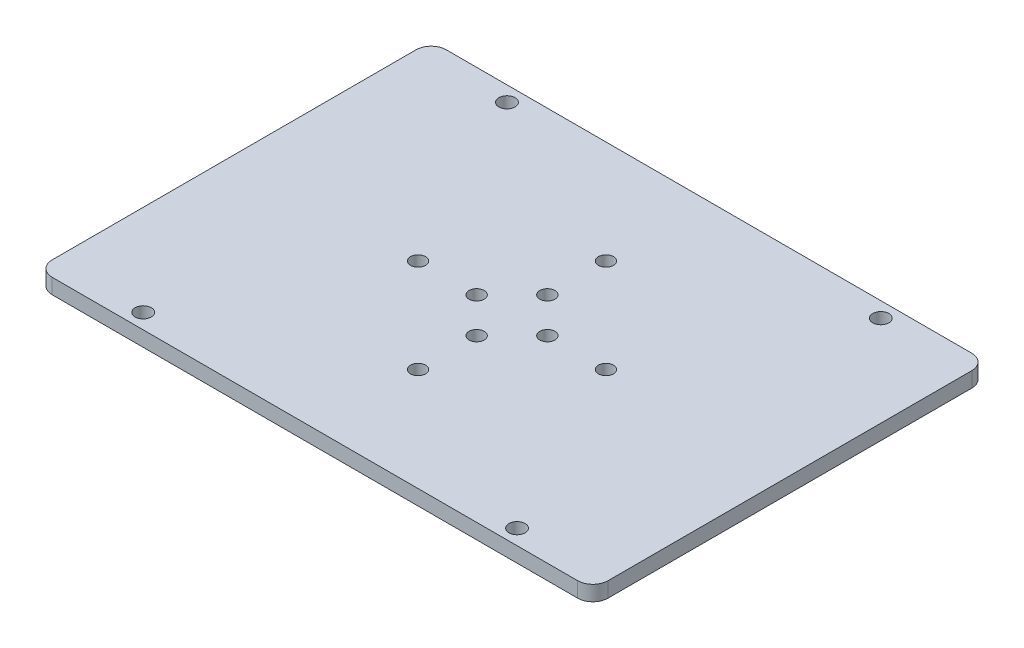
ISO-10303-21;
HEADER;
FILE_DESCRIPTION(('STEP AP214'),'2;1');
FILE_NAME('part.step','',(''),(''),'','','');
FILE_SCHEMA(('AUTOMOTIVE_DESIGN { 1 0 10303 214 1 1 1 1 }'));
ENDSEC;
DATA;
#1=APPLICATION_CONTEXT('core data for automotive mechanical design processes');
#2=APPLICATION_PROTOCOL_DEFINITION('international standard','automotive_design',2000,#1);
#3=PRODUCT_CONTEXT('',#1,'mechanical');
#4=PRODUCT('Part','Part','',(#3));
#5=PRODUCT_RELATED_PRODUCT_CATEGORY('part','',(#4));
#6=PRODUCT_DEFINITION_FORMATION('','',#4);
#7=PRODUCT_DEFINITION_CONTEXT('part definition',#1,'design');
#8=PRODUCT_DEFINITION('design','',#6,#7);
#9=PRODUCT_DEFINITION_SHAPE('','',#8);
#10=(LENGTH_UNIT() NAMED_UNIT(*) SI_UNIT(.MILLI.,.METRE.));
#11=(NAMED_UNIT(*) PLANE_ANGLE_UNIT() SI_UNIT($,.RADIAN.));
#12=(NAMED_UNIT(*) SI_UNIT($,.STERADIAN.) SOLID_ANGLE_UNIT());
#13=UNCERTAINTY_MEASURE_WITH_UNIT(LENGTH_MEASURE(1.E-05),#10,'distance_accuracy_value','');
#14=(GEOMETRIC_REPRESENTATION_CONTEXT(3) GLOBAL_UNCERTAINTY_ASSIGNED_CONTEXT((#13)) GLOBAL_UNIT_ASSIGNED_CONTEXT((#10,
#11,#12)) REPRESENTATION_CONTEXT('',''));
#15=CARTESIAN_POINT('',(0.,0.,0.));
#16=DIRECTION('',(0.,0.,1.));
#17=DIRECTION('',(1.,0.,0.));
#18=AXIS2_PLACEMENT_3D('',#15,#16,#17);
#19=CARTESIAN_POINT('',(0.,3.,0.));
#20=DIRECTION('',(0.,1.,0.));
#21=DIRECTION('',(0.,0.,1.));
#22=AXIS2_PLACEMENT_3D('',#19,#20,#21);
#23=PLANE('',#22);
#24=CARTESIAN_POINT('',(18.6,3.,0.));
#25=DIRECTION('',(0.,1.,0.));
#26=DIRECTION('',(0.,0.,1.));
#27=AXIS2_PLACEMENT_3D('',#24,#25,#26);
#28=CIRCLE('',#27,1.5);
#29=CARTESIAN_POINT('',(18.6,3.,1.5));
#30=VERTEX_POINT('',#29);
#31=EDGE_CURVE('E463',#30,#30,#28,.T.);
#32=ORIENTED_EDGE('',*,*,#31,.F.);
#33=EDGE_LOOP('',(#32));
#34=FACE_BOUND('',#33,.T.);
#35=CARTESIAN_POINT('',(-7.,3.,3.97274077722747E-13));
#36=DIRECTION('',(0.,1.,0.));
#37=DIRECTION('',(0.,0.,1.));
#38=AXIS2_PLACEMENT_3D('',#35,#36,#37);
#39=CIRCLE('',#38,1.50000000000045);
#40=CARTESIAN_POINT('',(-7.,3.,1.50000000000085));
#41=VERTEX_POINT('',#40);
#42=EDGE_CURVE('E465',#41,#41,#39,.T.);
#43=ORIENTED_EDGE('',*,*,#42,.F.);
#44=EDGE_LOOP('',(#43));
#45=FACE_BOUND('',#44,.T.);
#46=CARTESIAN_POINT('',(3.95581973927976E-13,3.,7.0000000000004));
#47=DIRECTION('',(0.,1.,0.));
#48=DIRECTION('',(0.,0.,1.));
#49=AXIS2_PLACEMENT_3D('',#46,#47,#48);
#50=CIRCLE('',#49,1.50000000000031);
#51=CARTESIAN_POINT('',(3.95581973927976E-13,3.,8.50000000000071));
#52=VERTEX_POINT('',#51);
#53=EDGE_CURVE('E471',#52,#52,#50,.T.);
#54=ORIENTED_EDGE('',*,*,#53,.F.);
#55=EDGE_LOOP('',(#54));
#56=FACE_BOUND('',#55,.T.);
#57=CARTESIAN_POINT('',(7.0000000000004,3.,0.));
#58=DIRECTION('',(0.,1.,0.));
#59=DIRECTION('',(0.,0.,1.));
#60=AXIS2_PLACEMENT_3D('',#57,#58,#59);
#61=CIRCLE('',#60,1.49999999999991);
#62=CARTESIAN_POINT('',(7.0000000000004,3.,1.49999999999991));
#63=VERTEX_POINT('',#62);
#64=EDGE_CURVE('E478',#63,#63,#61,.T.);
#65=ORIENTED_EDGE('',*,*,#64,.F.);
#66=EDGE_LOOP('',(#65));
#67=FACE_BOUND('',#66,.T.);
#68=CARTESIAN_POINT('',(-18.6,3.,0.));
#69=DIRECTION('',(0.,1.,0.));
#70=DIRECTION('',(0.,0.,-1.));
#71=AXIS2_PLACEMENT_3D('',#68,#69,#70);
#72=CIRCLE('',#71,1.5);
#73=CARTESIAN_POINT('',(-18.6,3.,-1.5));
#74=VERTEX_POINT('',#73);
#75=EDGE_CURVE('E466',#74,#74,#72,.T.);
#76=ORIENTED_EDGE('',*,*,#75,.F.);
#77=EDGE_LOOP('',(#76));
#78=FACE_BOUND('',#77,.T.);
#79=CARTESIAN_POINT('',(0.,3.,-18.6));
#80=DIRECTION('',(0.,1.,0.));
#81=DIRECTION('',(0.,0.,1.));
#82=AXIS2_PLACEMENT_3D('',#79,#80,#81);
#83=CIRCLE('',#82,1.5);
#84=CARTESIAN_POINT('',(0.,3.,-17.1));
#85=VERTEX_POINT('',#84);
#86=EDGE_CURVE('E474',#85,#85,#83,.T.);
#87=ORIENTED_EDGE('',*,*,#86,.F.);
#88=EDGE_LOOP('',(#87));
#89=FACE_BOUND('',#88,.T.);
#90=CARTESIAN_POINT('',(0.,3.,18.6));
#91=DIRECTION('',(0.,1.,0.));
#92=DIRECTION('',(0.,0.,-1.));
#93=AXIS2_PLACEMENT_3D('',#90,#91,#92);
#94=CIRCLE('',#93,1.5);
#95=CARTESIAN_POINT('',(0.,3.,17.1));
#96=VERTEX_POINT('',#95);
#97=EDGE_CURVE('E516',#96,#96,#94,.T.);
#98=ORIENTED_EDGE('',*,*,#97,.F.);
#99=EDGE_LOOP('',(#98));
#100=FACE_BOUND('',#99,.T.);
#101=CARTESIAN_POINT('',(0.,3.,-7.));
#102=DIRECTION('',(0.,1.,0.));
#103=DIRECTION('',(0.,0.,1.));
#104=AXIS2_PLACEMENT_3D('',#101,#102,#103);
#105=CIRCLE('',#104,1.5);
#106=CARTESIAN_POINT('',(0.,3.,-5.5));
#107=VERTEX_POINT('',#106);
#108=EDGE_CURVE('E196',#107,#107,#105,.T.);
#109=ORIENTED_EDGE('',*,*,#108,.F.);
#110=EDGE_LOOP('',(#109));
#111=FACE_BOUND('',#110,.T.);
#112=CARTESIAN_POINT('',(37.,3.,36.));
#113=DIRECTION('',(0.,1.,0.));
#114=DIRECTION('',(0.,0.,1.));
#115=AXIS2_PLACEMENT_3D('',#112,#113,#114);
#116=CIRCLE('',#115,1.60000000000001);
#117=CARTESIAN_POINT('',(37.,3.,37.6));
#118=VERTEX_POINT('',#117);
#119=EDGE_CURVE('E237',#118,#118,#116,.T.);
#120=ORIENTED_EDGE('',*,*,#119,.F.);
#121=EDGE_LOOP('',(#120));
#122=FACE_BOUND('',#121,.T.);
#123=CARTESIAN_POINT('',(-37.,3.,-36.));
#124=DIRECTION('',(0.,1.,0.));
#125=DIRECTION('',(0.,0.,1.));
#126=AXIS2_PLACEMENT_3D('',#123,#124,#125);
#127=CIRCLE('',#126,1.6);
#128=CARTESIAN_POINT('',(-37.,3.,-34.4));
#129=VERTEX_POINT('',#128);
#130=EDGE_CURVE('E137',#129,#129,#127,.T.);
#131=ORIENTED_EDGE('',*,*,#130,.F.);
#132=EDGE_LOOP('',(#131));
#133=FACE_BOUND('',#132,.T.);
#134=DIRECTION('',(-1.,0.,0.));
#135=VECTOR('',#134,1.);
#136=CARTESIAN_POINT('',(55.,3.,-39.));
#137=LINE('',#136,#135);
#138=CARTESIAN_POINT('',(52.,3.,-39.));
#139=VERTEX_POINT('',#138);
#140=CARTESIAN_POINT('',(-52.,3.,-39.));
#141=VERTEX_POINT('',#140);
#142=EDGE_CURVE('E148',#139,#141,#137,.T.);
#143=ORIENTED_EDGE('',*,*,#142,.T.);
#144=CARTESIAN_POINT('',(-52.,3.,-36.));
#145=DIRECTION('',(0.,1.,0.));
#146=DIRECTION('',(0.,0.,1.));
#147=AXIS2_PLACEMENT_3D('',#144,#145,#146);
#148=CIRCLE('',#147,3.);
#149=CARTESIAN_POINT('',(-55.,3.,-36.));
#150=VERTEX_POINT('',#149);
#151=EDGE_CURVE('E178',#141,#150,#148,.T.);
#152=ORIENTED_EDGE('',*,*,#151,.T.);
#153=DIRECTION('',(0.,0.,1.));
#154=VECTOR('',#153,1.);
#155=CARTESIAN_POINT('',(-55.,3.,39.));
#156=LINE('',#155,#154);
#157=CARTESIAN_POINT('',(-55.,3.,36.));
#158=VERTEX_POINT('',#157);
#159=EDGE_CURVE('E127',#150,#158,#156,.T.);
#160=ORIENTED_EDGE('',*,*,#159,.T.);
#161=CARTESIAN_POINT('',(-52.,3.,36.));
#162=DIRECTION('',(0.,1.,0.));
#163=DIRECTION('',(0.,0.,1.));
#164=AXIS2_PLACEMENT_3D('',#161,#162,#163);
#165=CIRCLE('',#164,3.);
#166=CARTESIAN_POINT('',(-52.,3.,39.));
#167=VERTEX_POINT('',#166);
#168=EDGE_CURVE('E175',#158,#167,#165,.T.);
#169=ORIENTED_EDGE('',*,*,#168,.T.);
#170=DIRECTION('',(1.,0.,0.));
#171=VECTOR('',#170,1.);
#172=CARTESIAN_POINT('',(55.,3.,39.));
#173=LINE('',#172,#171);
#174=CARTESIAN_POINT('',(52.,3.,39.));
#175=VERTEX_POINT('',#174);
#176=EDGE_CURVE('E257',#167,#175,#173,.T.);
#177=ORIENTED_EDGE('',*,*,#176,.T.);
#178=CARTESIAN_POINT('',(52.,3.,36.));
#179=DIRECTION('',(0.,1.,0.));
#180=DIRECTION('',(0.,0.,1.));
#181=AXIS2_PLACEMENT_3D('',#178,#179,#180);
#182=CIRCLE('',#181,3.);
#183=CARTESIAN_POINT('',(55.,3.,36.));
#184=VERTEX_POINT('',#183);
#185=EDGE_CURVE('E61',#175,#184,#182,.T.);
#186=ORIENTED_EDGE('',*,*,#185,.T.);
#187=DIRECTION('',(0.,0.,-1.));
#188=VECTOR('',#187,1.);
#189=CARTESIAN_POINT('',(55.,3.,39.));
#190=LINE('',#189,#188);
#191=CARTESIAN_POINT('',(55.,3.,-36.));
#192=VERTEX_POINT('',#191);
#193=EDGE_CURVE('E259',#184,#192,#190,.T.);
#194=ORIENTED_EDGE('',*,*,#193,.T.);
#195=CARTESIAN_POINT('',(52.,3.,-36.));
#196=DIRECTION('',(0.,1.,0.));
#197=DIRECTION('',(0.,0.,1.));
#198=AXIS2_PLACEMENT_3D('',#195,#196,#197);
#199=CIRCLE('',#198,3.);
#200=EDGE_CURVE('E172',#192,#139,#199,.T.);
#201=ORIENTED_EDGE('',*,*,#200,.T.);
#202=EDGE_LOOP('',(#143,#152,#160,#169,#177,#186,#194,#201));
#203=FACE_BOUND('',#202,.T.);
#204=CARTESIAN_POINT('',(37.,3.,-36.));
#205=DIRECTION('',(0.,1.,0.));
#206=DIRECTION('',(0.,0.,1.));
#207=AXIS2_PLACEMENT_3D('',#204,#205,#206);
#208=CIRCLE('',#207,1.60000000000001);
#209=CARTESIAN_POINT('',(37.,3.,-34.4));
#210=VERTEX_POINT('',#209);
#211=EDGE_CURVE('E245',#210,#210,#208,.T.);
#212=ORIENTED_EDGE('',*,*,#211,.F.);
#213=EDGE_LOOP('',(#212));
#214=FACE_BOUND('',#213,.T.);
#215=CARTESIAN_POINT('',(-37.,3.,36.));
#216=DIRECTION('',(0.,1.,0.));
#217=DIRECTION('',(0.,0.,1.));
#218=AXIS2_PLACEMENT_3D('',#215,#216,#217);
#219=CIRCLE('',#218,1.6);
#220=CARTESIAN_POINT('',(-37.,3.,37.6));
#221=VERTEX_POINT('',#220);
#222=EDGE_CURVE('E227',#221,#221,#219,.T.);
#223=ORIENTED_EDGE('',*,*,#222,.F.);
#224=EDGE_LOOP('',(#223));
#225=FACE_BOUND('',#224,.T.);
#226=ADVANCED_FACE('F38',(#34,#45,#56,#67,#78,#89,#100,#111,#122,#133,#203,#214,#225),#23,.T.);
#227=CARTESIAN_POINT('',(0.,0.,0.));
#228=DIRECTION('',(0.,1.,0.));
#229=DIRECTION('',(0.,0.,1.));
#230=AXIS2_PLACEMENT_3D('',#227,#228,#229);
#231=PLANE('',#230);
#232=CARTESIAN_POINT('',(18.6,0.,0.));
#233=DIRECTION('',(0.,1.,0.));
#234=DIRECTION('',(0.,0.,1.));
#235=AXIS2_PLACEMENT_3D('',#232,#233,#234);
#236=CIRCLE('',#235,1.5);
#237=CARTESIAN_POINT('',(18.6,0.,1.5));
#238=VERTEX_POINT('',#237);
#239=EDGE_CURVE('E42',#238,#238,#236,.T.);
#240=ORIENTED_EDGE('',*,*,#239,.T.);
#241=EDGE_LOOP('',(#240));
#242=FACE_BOUND('',#241,.T.);
#243=CARTESIAN_POINT('',(-7.,0.,3.97274077722747E-13));
#244=DIRECTION('',(0.,1.,0.));
#245=DIRECTION('',(0.,0.,1.));
#246=AXIS2_PLACEMENT_3D('',#243,#244,#245);
#247=CIRCLE('',#246,1.50000000000045);
#248=CARTESIAN_POINT('',(-7.,0.,1.50000000000085));
#249=VERTEX_POINT('',#248);
#250=EDGE_CURVE('E215',#249,#249,#247,.T.);
#251=ORIENTED_EDGE('',*,*,#250,.T.);
#252=EDGE_LOOP('',(#251));
#253=FACE_BOUND('',#252,.T.);
#254=CARTESIAN_POINT('',(3.95581973927976E-13,0.,7.0000000000004));
#255=DIRECTION('',(0.,1.,0.));
#256=DIRECTION('',(0.,0.,1.));
#257=AXIS2_PLACEMENT_3D('',#254,#255,#256);
#258=CIRCLE('',#257,1.50000000000031);
#259=CARTESIAN_POINT('',(3.95581973927976E-13,0.,8.50000000000071));
#260=VERTEX_POINT('',#259);
#261=EDGE_CURVE('E212',#260,#260,#258,.T.);
#262=ORIENTED_EDGE('',*,*,#261,.T.);
#263=EDGE_LOOP('',(#262));
#264=FACE_BOUND('',#263,.T.);
#265=CARTESIAN_POINT('',(7.0000000000004,0.,0.));
#266=DIRECTION('',(0.,1.,0.));
#267=DIRECTION('',(0.,0.,1.));
#268=AXIS2_PLACEMENT_3D('',#265,#266,#267);
#269=CIRCLE('',#268,1.49999999999991);
#270=CARTESIAN_POINT('',(7.0000000000004,0.,1.49999999999991));
#271=VERTEX_POINT('',#270);
#272=EDGE_CURVE('E208',#271,#271,#269,.T.);
#273=ORIENTED_EDGE('',*,*,#272,.T.);
#274=EDGE_LOOP('',(#273));
#275=FACE_BOUND('',#274,.T.);
#276=CARTESIAN_POINT('',(-18.6,0.,0.));
#277=DIRECTION('',(0.,1.,0.));
#278=DIRECTION('',(0.,0.,1.));
#279=AXIS2_PLACEMENT_3D('',#276,#277,#278);
#280=CIRCLE('',#279,1.5);
#281=CARTESIAN_POINT('',(-18.6,0.,1.5));
#282=VERTEX_POINT('',#281);
#283=EDGE_CURVE('E204',#282,#282,#280,.T.);
#284=ORIENTED_EDGE('',*,*,#283,.T.);
#285=EDGE_LOOP('',(#284));
#286=FACE_BOUND('',#285,.T.);
#287=CARTESIAN_POINT('',(0.,0.,-18.6));
#288=DIRECTION('',(0.,1.,0.));
#289=DIRECTION('',(0.,0.,1.));
#290=AXIS2_PLACEMENT_3D('',#287,#288,#289);
#291=CIRCLE('',#290,1.5);
#292=CARTESIAN_POINT('',(0.,0.,-17.1));
#293=VERTEX_POINT('',#292);
#294=EDGE_CURVE('E200',#293,#293,#291,.T.);
#295=ORIENTED_EDGE('',*,*,#294,.T.);
#296=EDGE_LOOP('',(#295));
#297=FACE_BOUND('',#296,.T.);
#298=CARTESIAN_POINT('',(0.,0.,18.6));
#299=DIRECTION('',(0.,1.,0.));
#300=DIRECTION('',(0.,0.,1.));
#301=AXIS2_PLACEMENT_3D('',#298,#299,#300);
#302=CIRCLE('',#301,1.5);
#303=CARTESIAN_POINT('',(0.,0.,20.1));
#304=VERTEX_POINT('',#303);
#305=EDGE_CURVE('E195',#304,#304,#302,.T.);
#306=ORIENTED_EDGE('',*,*,#305,.T.);
#307=EDGE_LOOP('',(#306));
#308=FACE_BOUND('',#307,.T.);
#309=CARTESIAN_POINT('',(0.,0.,-7.));
#310=DIRECTION('',(0.,1.,0.));
#311=DIRECTION('',(0.,0.,1.));
#312=AXIS2_PLACEMENT_3D('',#309,#310,#311);
#313=CIRCLE('',#312,1.5);
#314=CARTESIAN_POINT('',(0.,0.,-5.5));
#315=VERTEX_POINT('',#314);
#316=EDGE_CURVE('E191',#315,#315,#313,.T.);
#317=ORIENTED_EDGE('',*,*,#316,.T.);
#318=EDGE_LOOP('',(#317));
#319=FACE_BOUND('',#318,.T.);
#320=DIRECTION('',(0.,0.,1.));
#321=VECTOR('',#320,1.);
#322=CARTESIAN_POINT('',(-55.,0.,39.));
#323=LINE('',#322,#321);
#324=CARTESIAN_POINT('',(-55.,0.,-36.));
#325=VERTEX_POINT('',#324);
#326=CARTESIAN_POINT('',(-55.,0.,36.));
#327=VERTEX_POINT('',#326);
#328=EDGE_CURVE('E124',#325,#327,#323,.T.);
#329=ORIENTED_EDGE('',*,*,#328,.F.);
#330=CARTESIAN_POINT('',(-52.,0.,-36.));
#331=DIRECTION('',(0.,1.,0.));
#332=DIRECTION('',(0.,0.,1.));
#333=AXIS2_PLACEMENT_3D('',#330,#331,#332);
#334=CIRCLE('',#333,3.);
#335=CARTESIAN_POINT('',(-52.,0.,-39.));
#336=VERTEX_POINT('',#335);
#337=EDGE_CURVE('E106',#325,#336,#334,.F.);
#338=ORIENTED_EDGE('',*,*,#337,.T.);
#339=DIRECTION('',(-1.,0.,0.));
#340=VECTOR('',#339,1.);
#341=CARTESIAN_POINT('',(55.,0.,-39.));
#342=LINE('',#341,#340);
#343=CARTESIAN_POINT('',(52.,0.,-39.));
#344=VERTEX_POINT('',#343);
#345=EDGE_CURVE('E153',#344,#336,#342,.T.);
#346=ORIENTED_EDGE('',*,*,#345,.F.);
#347=CARTESIAN_POINT('',(52.,0.,-36.));
#348=DIRECTION('',(0.,1.,0.));
#349=DIRECTION('',(0.,0.,1.));
#350=AXIS2_PLACEMENT_3D('',#347,#348,#349);
#351=CIRCLE('',#350,3.);
#352=CARTESIAN_POINT('',(55.,0.,-36.));
#353=VERTEX_POINT('',#352);
#354=EDGE_CURVE('E160',#344,#353,#351,.F.);
#355=ORIENTED_EDGE('',*,*,#354,.T.);
#356=DIRECTION('',(0.,0.,-1.));
#357=VECTOR('',#356,1.);
#358=CARTESIAN_POINT('',(55.,0.,39.));
#359=LINE('',#358,#357);
#360=CARTESIAN_POINT('',(55.,0.,36.));
#361=VERTEX_POINT('',#360);
#362=EDGE_CURVE('E142',#361,#353,#359,.T.);
#363=ORIENTED_EDGE('',*,*,#362,.F.);
#364=CARTESIAN_POINT('',(52.,0.,36.));
#365=DIRECTION('',(0.,1.,0.));
#366=DIRECTION('',(0.,0.,1.));
#367=AXIS2_PLACEMENT_3D('',#364,#365,#366);
#368=CIRCLE('',#367,3.);
#369=CARTESIAN_POINT('',(52.,0.,39.));
#370=VERTEX_POINT('',#369);
#371=EDGE_CURVE('E129',#361,#370,#368,.F.);
#372=ORIENTED_EDGE('',*,*,#371,.T.);
#373=DIRECTION('',(1.,0.,0.));
#374=VECTOR('',#373,1.);
#375=CARTESIAN_POINT('',(55.,0.,39.));
#376=LINE('',#375,#374);
#377=CARTESIAN_POINT('',(-52.,0.,39.));
#378=VERTEX_POINT('',#377);
#379=EDGE_CURVE('E136',#378,#370,#376,.T.);
#380=ORIENTED_EDGE('',*,*,#379,.F.);
#381=CARTESIAN_POINT('',(-52.,0.,36.));
#382=DIRECTION('',(0.,1.,0.));
#383=DIRECTION('',(0.,0.,1.));
#384=AXIS2_PLACEMENT_3D('',#381,#382,#383);
#385=CIRCLE('',#384,3.);
#386=EDGE_CURVE('E118',#378,#327,#385,.F.);
#387=ORIENTED_EDGE('',*,*,#386,.T.);
#388=EDGE_LOOP('',(#329,#338,#346,#355,#363,#372,#380,#387));
#389=FACE_BOUND('',#388,.T.);
#390=CARTESIAN_POINT('',(-37.,0.,-36.));
#391=DIRECTION('',(0.,1.,0.));
#392=DIRECTION('',(0.,0.,1.));
#393=AXIS2_PLACEMENT_3D('',#390,#391,#392);
#394=CIRCLE('',#393,1.6);
#395=CARTESIAN_POINT('',(-37.,0.,-34.4));
#396=VERTEX_POINT('',#395);
#397=EDGE_CURVE('E145',#396,#396,#394,.T.);
#398=ORIENTED_EDGE('',*,*,#397,.T.);
#399=EDGE_LOOP('',(#398));
#400=FACE_BOUND('',#399,.T.);
#401=CARTESIAN_POINT('',(37.,0.,-36.));
#402=DIRECTION('',(0.,1.,0.));
#403=DIRECTION('',(0.,0.,1.));
#404=AXIS2_PLACEMENT_3D('',#401,#402,#403);
#405=CIRCLE('',#404,1.60000000000001);
#406=CARTESIAN_POINT('',(37.,0.,-34.4));
#407=VERTEX_POINT('',#406);
#408=EDGE_CURVE('E241',#407,#407,#405,.T.);
#409=ORIENTED_EDGE('',*,*,#408,.T.);
#410=EDGE_LOOP('',(#409));
#411=FACE_BOUND('',#410,.T.);
#412=CARTESIAN_POINT('',(37.,0.,36.));
#413=DIRECTION('',(0.,1.,0.));
#414=DIRECTION('',(0.,0.,1.));
#415=AXIS2_PLACEMENT_3D('',#412,#413,#414);
#416=CIRCLE('',#415,1.60000000000001);
#417=CARTESIAN_POINT('',(37.,0.,37.6));
#418=VERTEX_POINT('',#417);
#419=EDGE_CURVE('E233',#418,#418,#416,.T.);
#420=ORIENTED_EDGE('',*,*,#419,.T.);
#421=EDGE_LOOP('',(#420));
#422=FACE_BOUND('',#421,.T.);
#423=CARTESIAN_POINT('',(-37.,0.,36.));
#424=DIRECTION('',(0.,1.,0.));
#425=DIRECTION('',(0.,0.,1.));
#426=AXIS2_PLACEMENT_3D('',#423,#424,#425);
#427=CIRCLE('',#426,1.6);
#428=CARTESIAN_POINT('',(-37.,0.,37.6));
#429=VERTEX_POINT('',#428);
#430=EDGE_CURVE('E222',#429,#429,#427,.T.);
#431=ORIENTED_EDGE('',*,*,#430,.T.);
#432=EDGE_LOOP('',(#431));
#433=FACE_BOUND('',#432,.T.);
#434=ADVANCED_FACE('F132',(#242,#253,#264,#275,#286,#297,#308,#319,#389,#400,#411,#422,#433),
#231,.F.);
#435=CARTESIAN_POINT('',(-55.,3.,39.));
#436=DIRECTION('',(1.,0.,0.));
#437=DIRECTION('',(0.,0.,-1.));
#438=AXIS2_PLACEMENT_3D('',#435,#436,#437);
#439=PLANE('',#438);
#440=ORIENTED_EDGE('',*,*,#159,.F.);
#441=DIRECTION('',(0.,-1.,0.));
#442=VECTOR('',#441,1.);
#443=CARTESIAN_POINT('',(-55.,3.,-36.));
#444=LINE('',#443,#442);
#445=EDGE_CURVE('E110',#150,#325,#444,.T.);
#446=ORIENTED_EDGE('',*,*,#445,.T.);
#447=ORIENTED_EDGE('',*,*,#328,.T.);
#448=DIRECTION('',(0.,-1.,0.));
#449=VECTOR('',#448,1.);
#450=CARTESIAN_POINT('',(-55.,3.,36.));
#451=LINE('',#450,#449);
#452=EDGE_CURVE('E130',#327,#158,#451,.F.);
#453=ORIENTED_EDGE('',*,*,#452,.T.);
#454=EDGE_LOOP('',(#440,#446,#447,#453));
#455=FACE_BOUND('',#454,.T.);
#456=ADVANCED_FACE('F123',(#455),#439,.F.);
#457=CARTESIAN_POINT('',(55.,3.,39.));
#458=DIRECTION('',(0.,0.,-1.));
#459=DIRECTION('',(-1.,0.,0.));
#460=AXIS2_PLACEMENT_3D('',#457,#458,#459);
#461=PLANE('',#460);
#462=ORIENTED_EDGE('',*,*,#176,.F.);
#463=DIRECTION('',(0.,-1.,0.));
#464=VECTOR('',#463,1.);
#465=CARTESIAN_POINT('',(-52.,3.,39.));
#466=LINE('',#465,#464);
#467=EDGE_CURVE('E184',#167,#378,#466,.T.);
#468=ORIENTED_EDGE('',*,*,#467,.T.);
#469=ORIENTED_EDGE('',*,*,#379,.T.);
#470=DIRECTION('',(0.,-1.,0.));
#471=VECTOR('',#470,1.);
#472=CARTESIAN_POINT('',(52.,3.,39.));
#473=LINE('',#472,#471);
#474=EDGE_CURVE('E181',#370,#175,#473,.F.);
#475=ORIENTED_EDGE('',*,*,#474,.T.);
#476=EDGE_LOOP('',(#462,#468,#469,#475));
#477=FACE_BOUND('',#476,.T.);
#478=ADVANCED_FACE('F278',(#477),#461,.F.);
#479=CARTESIAN_POINT('',(55.,3.,39.));
#480=DIRECTION('',(-1.,0.,0.));
#481=DIRECTION('',(0.,0.,1.));
#482=AXIS2_PLACEMENT_3D('',#479,#480,#481);
#483=PLANE('',#482);
#484=ORIENTED_EDGE('',*,*,#362,.T.);
#485=DIRECTION('',(0.,-1.,0.));
#486=VECTOR('',#485,1.);
#487=CARTESIAN_POINT('',(55.,3.,-36.));
#488=LINE('',#487,#486);
#489=EDGE_CURVE('E11',#353,#192,#488,.F.);
#490=ORIENTED_EDGE('',*,*,#489,.T.);
#491=ORIENTED_EDGE('',*,*,#193,.F.);
#492=DIRECTION('',(0.,-1.,0.));
#493=VECTOR('',#492,1.);
#494=CARTESIAN_POINT('',(55.,3.,36.));
#495=LINE('',#494,#493);
#496=EDGE_CURVE('E48',#184,#361,#495,.T.);
#497=ORIENTED_EDGE('',*,*,#496,.T.);
#498=EDGE_LOOP('',(#484,#490,#491,#497));
#499=FACE_BOUND('',#498,.T.);
#500=ADVANCED_FACE('F272',(#499),#483,.F.);
#501=CARTESIAN_POINT('',(55.,3.,-39.));
#502=DIRECTION('',(0.,0.,1.));
#503=DIRECTION('',(1.,0.,0.));
#504=AXIS2_PLACEMENT_3D('',#501,#502,#503);
#505=PLANE('',#504);
#506=ORIENTED_EDGE('',*,*,#345,.T.);
#507=DIRECTION('',(0.,-1.,0.));
#508=VECTOR('',#507,1.);
#509=CARTESIAN_POINT('',(-52.,3.,-39.));
#510=LINE('',#509,#508);
#511=EDGE_CURVE('E111',#336,#141,#510,.F.);
#512=ORIENTED_EDGE('',*,*,#511,.T.);
#513=ORIENTED_EDGE('',*,*,#142,.F.);
#514=DIRECTION('',(0.,-1.,0.));
#515=VECTOR('',#514,1.);
#516=CARTESIAN_POINT('',(52.,3.,-39.));
#517=LINE('',#516,#515);
#518=EDGE_CURVE('E117',#139,#344,#517,.T.);
#519=ORIENTED_EDGE('',*,*,#518,.T.);
#520=EDGE_LOOP('',(#506,#512,#513,#519));
#521=FACE_BOUND('',#520,.T.);
#522=ADVANCED_FACE('F268',(#521),#505,.F.);
#523=CARTESIAN_POINT('',(-37.,3.,-36.));
#524=DIRECTION('',(0.,-1.,0.));
#525=DIRECTION('',(0.,0.,-1.));
#526=AXIS2_PLACEMENT_3D('',#523,#524,#525);
#527=CYLINDRICAL_SURFACE('',#526,1.6);
#528=ORIENTED_EDGE('',*,*,#130,.T.);
#529=EDGE_LOOP('',(#528));
#530=FACE_BOUND('',#529,.T.);
#531=ORIENTED_EDGE('',*,*,#397,.F.);
#532=EDGE_LOOP('',(#531));
#533=FACE_BOUND('',#532,.T.);
#534=ADVANCED_FACE('F302',(#530,#533),#527,.F.);
#535=CARTESIAN_POINT('',(37.,3.,-36.));
#536=DIRECTION('',(0.,-1.,0.));
#537=DIRECTION('',(0.,0.,-1.));
#538=AXIS2_PLACEMENT_3D('',#535,#536,#537);
#539=CYLINDRICAL_SURFACE('',#538,1.60000000000001);
#540=ORIENTED_EDGE('',*,*,#211,.T.);
#541=EDGE_LOOP('',(#540));
#542=FACE_BOUND('',#541,.T.);
#543=ORIENTED_EDGE('',*,*,#408,.F.);
#544=EDGE_LOOP('',(#543));
#545=FACE_BOUND('',#544,.T.);
#546=ADVANCED_FACE('F337',(#542,#545),#539,.F.);
#547=CARTESIAN_POINT('',(37.,3.,36.));
#548=DIRECTION('',(0.,-1.,0.));
#549=DIRECTION('',(0.,0.,-1.));
#550=AXIS2_PLACEMENT_3D('',#547,#548,#549);
#551=CYLINDRICAL_SURFACE('',#550,1.60000000000001);
#552=ORIENTED_EDGE('',*,*,#119,.T.);
#553=EDGE_LOOP('',(#552));
#554=FACE_BOUND('',#553,.T.);
#555=ORIENTED_EDGE('',*,*,#419,.F.);
#556=EDGE_LOOP('',(#555));
#557=FACE_BOUND('',#556,.T.);
#558=ADVANCED_FACE('F344',(#554,#557),#551,.F.);
#559=CARTESIAN_POINT('',(-37.,3.,36.));
#560=DIRECTION('',(0.,-1.,0.));
#561=DIRECTION('',(0.,0.,-1.));
#562=AXIS2_PLACEMENT_3D('',#559,#560,#561);
#563=CYLINDRICAL_SURFACE('',#562,1.6);
#564=ORIENTED_EDGE('',*,*,#222,.T.);
#565=EDGE_LOOP('',(#564));
#566=FACE_BOUND('',#565,.T.);
#567=ORIENTED_EDGE('',*,*,#430,.F.);
#568=EDGE_LOOP('',(#567));
#569=FACE_BOUND('',#568,.T.);
#570=ADVANCED_FACE('F289',(#566,#569),#563,.F.);
#571=CARTESIAN_POINT('',(-52.,3.,-36.));
#572=DIRECTION('',(0.,-1.,0.));
#573=DIRECTION('',(0.,0.,-1.));
#574=AXIS2_PLACEMENT_3D('',#571,#572,#573);
#575=CYLINDRICAL_SURFACE('',#574,3.);
#576=ORIENTED_EDGE('',*,*,#151,.F.);
#577=ORIENTED_EDGE('',*,*,#511,.F.);
#578=ORIENTED_EDGE('',*,*,#337,.F.);
#579=ORIENTED_EDGE('',*,*,#445,.F.);
#580=EDGE_LOOP('',(#576,#577,#578,#579));
#581=FACE_BOUND('',#580,.T.);
#582=ADVANCED_FACE('F109',(#581),#575,.T.);
#583=CARTESIAN_POINT('',(-52.,3.,36.));
#584=DIRECTION('',(0.,-1.,0.));
#585=DIRECTION('',(0.,0.,-1.));
#586=AXIS2_PLACEMENT_3D('',#583,#584,#585);
#587=CYLINDRICAL_SURFACE('',#586,3.);
#588=ORIENTED_EDGE('',*,*,#168,.F.);
#589=ORIENTED_EDGE('',*,*,#452,.F.);
#590=ORIENTED_EDGE('',*,*,#386,.F.);
#591=ORIENTED_EDGE('',*,*,#467,.F.);
#592=EDGE_LOOP('',(#588,#589,#590,#591));
#593=FACE_BOUND('',#592,.T.);
#594=ADVANCED_FACE('F282',(#593),#587,.T.);
#595=CARTESIAN_POINT('',(52.,3.,-36.));
#596=DIRECTION('',(0.,-1.,0.));
#597=DIRECTION('',(0.,0.,-1.));
#598=AXIS2_PLACEMENT_3D('',#595,#596,#597);
#599=CYLINDRICAL_SURFACE('',#598,3.);
#600=ORIENTED_EDGE('',*,*,#200,.F.);
#601=ORIENTED_EDGE('',*,*,#489,.F.);
#602=ORIENTED_EDGE('',*,*,#354,.F.);
#603=ORIENTED_EDGE('',*,*,#518,.F.);
#604=EDGE_LOOP('',(#600,#601,#602,#603));
#605=FACE_BOUND('',#604,.T.);
#606=ADVANCED_FACE('F270',(#605),#599,.T.);
#607=CARTESIAN_POINT('',(52.,3.,36.));
#608=DIRECTION('',(0.,-1.,0.));
#609=DIRECTION('',(0.,0.,-1.));
#610=AXIS2_PLACEMENT_3D('',#607,#608,#609);
#611=CYLINDRICAL_SURFACE('',#610,3.);
#612=ORIENTED_EDGE('',*,*,#185,.F.);
#613=ORIENTED_EDGE('',*,*,#474,.F.);
#614=ORIENTED_EDGE('',*,*,#371,.F.);
#615=ORIENTED_EDGE('',*,*,#496,.F.);
#616=EDGE_LOOP('',(#612,#613,#614,#615));
#617=FACE_BOUND('',#616,.T.);
#618=ADVANCED_FACE('F40',(#617),#611,.T.);
#619=CARTESIAN_POINT('',(0.,-7.,-7.));
#620=DIRECTION('',(0.,1.,0.));
#621=DIRECTION('',(0.,0.,1.));
#622=AXIS2_PLACEMENT_3D('',#619,#620,#621);
#623=CYLINDRICAL_SURFACE('',#622,1.5);
#624=ORIENTED_EDGE('',*,*,#108,.T.);
#625=EDGE_LOOP('',(#624));
#626=FACE_BOUND('',#625,.T.);
#627=ORIENTED_EDGE('',*,*,#316,.F.);
#628=EDGE_LOOP('',(#627));
#629=FACE_BOUND('',#628,.T.);
#630=ADVANCED_FACE('F378',(#626,#629),#623,.F.);
#631=CARTESIAN_POINT('',(0.,-7.,18.6));
#632=DIRECTION('',(0.,1.,0.));
#633=DIRECTION('',(0.,0.,1.));
#634=AXIS2_PLACEMENT_3D('',#631,#632,#633);
#635=CYLINDRICAL_SURFACE('',#634,1.5);
#636=ORIENTED_EDGE('',*,*,#97,.T.);
#637=EDGE_LOOP('',(#636));
#638=FACE_BOUND('',#637,.T.);
#639=ORIENTED_EDGE('',*,*,#305,.F.);
#640=EDGE_LOOP('',(#639));
#641=FACE_BOUND('',#640,.T.);
#642=ADVANCED_FACE('F387',(#638,#641),#635,.F.);
#643=CARTESIAN_POINT('',(0.,-7.,-18.6));
#644=DIRECTION('',(0.,1.,0.));
#645=DIRECTION('',(0.,0.,1.));
#646=AXIS2_PLACEMENT_3D('',#643,#644,#645);
#647=CYLINDRICAL_SURFACE('',#646,1.5);
#648=ORIENTED_EDGE('',*,*,#86,.T.);
#649=EDGE_LOOP('',(#648));
#650=FACE_BOUND('',#649,.T.);
#651=ORIENTED_EDGE('',*,*,#294,.F.);
#652=EDGE_LOOP('',(#651));
#653=FACE_BOUND('',#652,.T.);
#654=ADVANCED_FACE('F394',(#650,#653),#647,.F.);
#655=CARTESIAN_POINT('',(-18.6,-7.,0.));
#656=DIRECTION('',(0.,1.,0.));
#657=DIRECTION('',(0.,0.,1.));
#658=AXIS2_PLACEMENT_3D('',#655,#656,#657);
#659=CYLINDRICAL_SURFACE('',#658,1.5);
#660=ORIENTED_EDGE('',*,*,#75,.T.);
#661=EDGE_LOOP('',(#660));
#662=FACE_BOUND('',#661,.T.);
#663=ORIENTED_EDGE('',*,*,#283,.F.);
#664=EDGE_LOOP('',(#663));
#665=FACE_BOUND('',#664,.T.);
#666=ADVANCED_FACE('F402',(#662,#665),#659,.F.);
#667=CARTESIAN_POINT('',(7.0000000000004,-7.,0.));
#668=DIRECTION('',(0.,1.,0.));
#669=DIRECTION('',(0.,0.,1.));
#670=AXIS2_PLACEMENT_3D('',#667,#668,#669);
#671=CYLINDRICAL_SURFACE('',#670,1.49999999999991);
#672=ORIENTED_EDGE('',*,*,#64,.T.);
#673=EDGE_LOOP('',(#672));
#674=FACE_BOUND('',#673,.T.);
#675=ORIENTED_EDGE('',*,*,#272,.F.);
#676=EDGE_LOOP('',(#675));
#677=FACE_BOUND('',#676,.T.);
#678=ADVANCED_FACE('F410',(#674,#677),#671,.F.);
#679=CARTESIAN_POINT('',(3.95581973927976E-13,-7.,7.0000000000004));
#680=DIRECTION('',(0.,1.,0.));
#681=DIRECTION('',(0.,0.,1.));
#682=AXIS2_PLACEMENT_3D('',#679,#680,#681);
#683=CYLINDRICAL_SURFACE('',#682,1.50000000000031);
#684=ORIENTED_EDGE('',*,*,#53,.T.);
#685=EDGE_LOOP('',(#684));
#686=FACE_BOUND('',#685,.T.);
#687=ORIENTED_EDGE('',*,*,#261,.F.);
#688=EDGE_LOOP('',(#687));
#689=FACE_BOUND('',#688,.T.);
#690=ADVANCED_FACE('F418',(#686,#689),#683,.F.);
#691=CARTESIAN_POINT('',(-7.,-7.,3.97274077722747E-13));
#692=DIRECTION('',(0.,1.,0.));
#693=DIRECTION('',(0.,0.,1.));
#694=AXIS2_PLACEMENT_3D('',#691,#692,#693);
#695=CYLINDRICAL_SURFACE('',#694,1.50000000000045);
#696=ORIENTED_EDGE('',*,*,#42,.T.);
#697=EDGE_LOOP('',(#696));
#698=FACE_BOUND('',#697,.T.);
#699=ORIENTED_EDGE('',*,*,#250,.F.);
#700=EDGE_LOOP('',(#699));
#701=FACE_BOUND('',#700,.T.);
#702=ADVANCED_FACE('F426',(#698,#701),#695,.F.);
#703=CARTESIAN_POINT('',(18.6,-7.,0.));
#704=DIRECTION('',(0.,1.,0.));
#705=DIRECTION('',(0.,0.,1.));
#706=AXIS2_PLACEMENT_3D('',#703,#704,#705);
#707=CYLINDRICAL_SURFACE('',#706,1.5);
#708=ORIENTED_EDGE('',*,*,#31,.T.);
#709=EDGE_LOOP('',(#708));
#710=FACE_BOUND('',#709,.T.);
#711=ORIENTED_EDGE('',*,*,#239,.F.);
#712=EDGE_LOOP('',(#711));
#713=FACE_BOUND('',#712,.T.);
#714=ADVANCED_FACE('F434',(#710,#713),#707,.F.);
#715=CLOSED_SHELL('',(#226,#434,#456,#478,#500,#522,#534,#546,#558,#570,#582,#594,#606,#618,
#630,#642,#654,#666,#678,#690,#702,#714));
#716=MANIFOLD_SOLID_BREP('B2',#715);
#717=ADVANCED_BREP_SHAPE_REPRESENTATION('',(#18,#716),#14);
#718=SHAPE_DEFINITION_REPRESENTATION(#9,#717);
ENDSEC;
END-ISO-10303-21;
